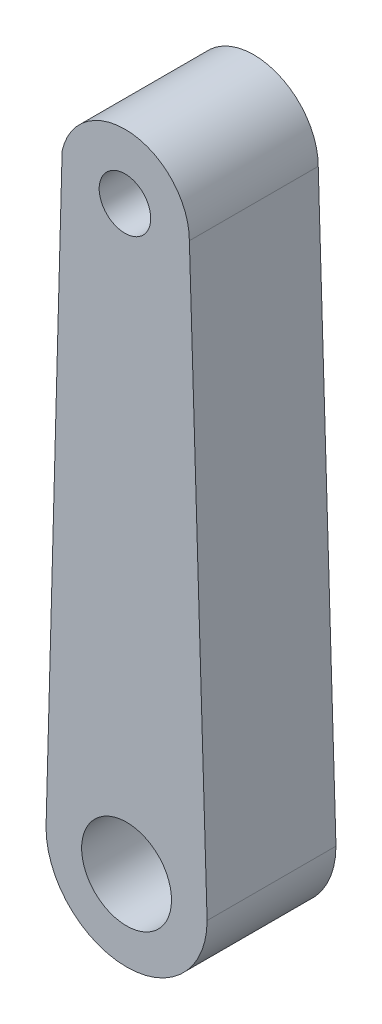
ISO-10303-21;
HEADER;
FILE_DESCRIPTION(('STEP AP214'),'2;1');
FILE_NAME('part.step','',(''),(''),'','','');
FILE_SCHEMA(('AUTOMOTIVE_DESIGN { 1 0 10303 214 1 1 1 1 }'));
ENDSEC;
DATA;
#1=APPLICATION_CONTEXT('core data for automotive mechanical design processes');
#2=APPLICATION_PROTOCOL_DEFINITION('international standard','automotive_design',2000,#1);
#3=PRODUCT_CONTEXT('',#1,'mechanical');
#4=PRODUCT('Part','Part','',(#3));
#5=PRODUCT_RELATED_PRODUCT_CATEGORY('part','',(#4));
#6=PRODUCT_DEFINITION_FORMATION('','',#4);
#7=PRODUCT_DEFINITION_CONTEXT('part definition',#1,'design');
#8=PRODUCT_DEFINITION('design','',#6,#7);
#9=PRODUCT_DEFINITION_SHAPE('','',#8);
#10=(LENGTH_UNIT() NAMED_UNIT(*) SI_UNIT(.MILLI.,.METRE.));
#11=(NAMED_UNIT(*) PLANE_ANGLE_UNIT() SI_UNIT($,.RADIAN.));
#12=(NAMED_UNIT(*) SI_UNIT($,.STERADIAN.) SOLID_ANGLE_UNIT());
#13=UNCERTAINTY_MEASURE_WITH_UNIT(LENGTH_MEASURE(1.E-05),#10,'distance_accuracy_value','');
#14=(GEOMETRIC_REPRESENTATION_CONTEXT(3) GLOBAL_UNCERTAINTY_ASSIGNED_CONTEXT((#13)) GLOBAL_UNIT_ASSIGNED_CONTEXT((#10,
#11,#12)) REPRESENTATION_CONTEXT('',''));
#15=CARTESIAN_POINT('',(0.,0.,0.));
#16=DIRECTION('',(0.,0.,1.));
#17=DIRECTION('',(1.,0.,0.));
#18=AXIS2_PLACEMENT_3D('',#15,#16,#17);
#19=CARTESIAN_POINT('',(0.,0.,10.));
#20=DIRECTION('',(0.,0.,-1.));
#21=DIRECTION('',(-1.,0.,0.));
#22=AXIS2_PLACEMENT_3D('',#19,#20,#21);
#23=CYLINDRICAL_SURFACE('',#22,12.5);
#24=CARTESIAN_POINT('',(0.,0.,-10.));
#25=DIRECTION('',(0.,0.,1.));
#26=DIRECTION('',(1.,0.,0.));
#27=AXIS2_PLACEMENT_3D('',#24,#25,#26);
#28=CIRCLE('',#27,12.5);
#29=CARTESIAN_POINT('',(-12.5,0.,-10.));
#30=VERTEX_POINT('',#29);
#31=CARTESIAN_POINT('',(12.5,0.,-10.));
#32=VERTEX_POINT('',#31);
#33=EDGE_CURVE('E102',#30,#32,#28,.T.);
#34=ORIENTED_EDGE('',*,*,#33,.T.);
#35=DIRECTION('',(0.,0.,-1.));
#36=VECTOR('',#35,1.);
#37=CARTESIAN_POINT('',(12.5,0.,10.));
#38=LINE('',#37,#36);
#39=CARTESIAN_POINT('',(12.5,0.,10.));
#40=VERTEX_POINT('',#39);
#41=EDGE_CURVE('E11',#40,#32,#38,.T.);
#42=ORIENTED_EDGE('',*,*,#41,.F.);
#43=CARTESIAN_POINT('',(0.,0.,10.));
#44=DIRECTION('',(0.,0.,1.));
#45=DIRECTION('',(1.,0.,0.));
#46=AXIS2_PLACEMENT_3D('',#43,#44,#45);
#47=CIRCLE('',#46,12.5);
#48=CARTESIAN_POINT('',(-12.5,0.,10.));
#49=VERTEX_POINT('',#48);
#50=EDGE_CURVE('E90',#49,#40,#47,.T.);
#51=ORIENTED_EDGE('',*,*,#50,.F.);
#52=DIRECTION('',(0.,0.,-1.));
#53=VECTOR('',#52,1.);
#54=CARTESIAN_POINT('',(-12.5,0.,10.));
#55=LINE('',#54,#53);
#56=EDGE_CURVE('E98',#49,#30,#55,.T.);
#57=ORIENTED_EDGE('',*,*,#56,.T.);
#58=EDGE_LOOP('',(#34,#42,#51,#57));
#59=FACE_BOUND('',#58,.T.);
#60=ADVANCED_FACE('F39',(#59),#23,.T.);
#61=CARTESIAN_POINT('',(12.5,0.,10.));
#62=DIRECTION('',(-0.99953263266437,-0.0305698583417314,0.));
#63=DIRECTION('',(0.0305698583417314,-0.99953263266437,0.));
#64=AXIS2_PLACEMENT_3D('',#61,#62,#63);
#65=PLANE('',#64);
#66=DIRECTION('',(-0.0305698583417314,0.99953263266437,0.));
#67=VECTOR('',#66,1.);
#68=CARTESIAN_POINT('',(12.5,0.,-10.));
#69=LINE('',#68,#67);
#70=CARTESIAN_POINT('',(9.74743712456775,89.9996456214909,-10.));
#71=VERTEX_POINT('',#70);
#72=EDGE_CURVE('E94',#32,#71,#69,.T.);
#73=ORIENTED_EDGE('',*,*,#72,.T.);
#74=DIRECTION('',(0.,0.,-1.));
#75=VECTOR('',#74,1.);
#76=CARTESIAN_POINT('',(9.74743712456775,89.9996456214909,10.));
#77=LINE('',#76,#75);
#78=CARTESIAN_POINT('',(9.74743712456775,89.9996456214909,10.));
#79=VERTEX_POINT('',#78);
#80=EDGE_CURVE('E47',#79,#71,#77,.T.);
#81=ORIENTED_EDGE('',*,*,#80,.F.);
#82=DIRECTION('',(-0.0305698583417314,0.99953263266437,0.));
#83=VECTOR('',#82,1.);
#84=CARTESIAN_POINT('',(12.5,0.,10.));
#85=LINE('',#84,#83);
#86=EDGE_CURVE('E85',#40,#79,#85,.T.);
#87=ORIENTED_EDGE('',*,*,#86,.F.);
#88=ORIENTED_EDGE('',*,*,#41,.T.);
#89=EDGE_LOOP('',(#73,#81,#87,#88));
#90=FACE_BOUND('',#89,.T.);
#91=ADVANCED_FACE('F93',(#90),#65,.F.);
#92=CARTESIAN_POINT('',(-0.252562875432245,89.9996456214909,10.));
#93=DIRECTION('',(0.,0.,-1.));
#94=DIRECTION('',(-1.,0.,0.));
#95=AXIS2_PLACEMENT_3D('',#92,#93,#94);
#96=CYLINDRICAL_SURFACE('',#95,10.);
#97=CARTESIAN_POINT('',(-0.252562875432245,89.9996456214909,-10.));
#98=DIRECTION('',(0.,0.,1.));
#99=DIRECTION('',(-1.,0.,0.));
#100=AXIS2_PLACEMENT_3D('',#97,#98,#99);
#101=CIRCLE('',#100,10.);
#102=CARTESIAN_POINT('',(-10.0000000000001,92.2329099369261,-10.));
#103=VERTEX_POINT('',#102);
#104=EDGE_CURVE('E72',#71,#103,#101,.T.);
#105=ORIENTED_EDGE('',*,*,#104,.T.);
#106=DIRECTION('',(0.,0.,-1.));
#107=VECTOR('',#106,1.);
#108=CARTESIAN_POINT('',(-10.0000000000001,92.2329099369261,10.));
#109=LINE('',#108,#107);
#110=CARTESIAN_POINT('',(-10.0000000000001,92.2329099369261,10.));
#111=VERTEX_POINT('',#110);
#112=EDGE_CURVE('E95',#111,#103,#109,.T.);
#113=ORIENTED_EDGE('',*,*,#112,.F.);
#114=CARTESIAN_POINT('',(-0.252562875432245,89.9996456214909,10.));
#115=DIRECTION('',(0.,0.,1.));
#116=DIRECTION('',(-1.,0.,0.));
#117=AXIS2_PLACEMENT_3D('',#114,#115,#116);
#118=CIRCLE('',#117,10.);
#119=EDGE_CURVE('E88',#79,#111,#118,.T.);
#120=ORIENTED_EDGE('',*,*,#119,.F.);
#121=ORIENTED_EDGE('',*,*,#80,.T.);
#122=EDGE_LOOP('',(#105,#113,#120,#121));
#123=FACE_BOUND('',#122,.T.);
#124=ADVANCED_FACE('F96',(#123),#96,.T.);
#125=CARTESIAN_POINT('',(-12.5,0.,10.));
#126=DIRECTION('',(0.999632853853288,-0.0270953408749884,0.));
#127=DIRECTION('',(0.0270953408749884,0.999632853853288,0.));
#128=AXIS2_PLACEMENT_3D('',#125,#126,#127);
#129=PLANE('',#128);
#130=DIRECTION('',(-0.0270953408749884,-0.999632853853288,0.));
#131=VECTOR('',#130,1.);
#132=CARTESIAN_POINT('',(-12.5,0.,-10.));
#133=LINE('',#132,#131);
#134=EDGE_CURVE('E78',#103,#30,#133,.T.);
#135=ORIENTED_EDGE('',*,*,#134,.T.);
#136=ORIENTED_EDGE('',*,*,#56,.F.);
#137=DIRECTION('',(-0.0270953408749884,-0.999632853853288,0.));
#138=VECTOR('',#137,1.);
#139=CARTESIAN_POINT('',(-12.5,0.,10.));
#140=LINE('',#139,#138);
#141=EDGE_CURVE('E55',#111,#49,#140,.T.);
#142=ORIENTED_EDGE('',*,*,#141,.F.);
#143=ORIENTED_EDGE('',*,*,#112,.T.);
#144=EDGE_LOOP('',(#135,#136,#142,#143));
#145=FACE_BOUND('',#144,.T.);
#146=ADVANCED_FACE('F110',(#145),#129,.F.);
#147=CARTESIAN_POINT('',(0.,0.,10.));
#148=DIRECTION('',(0.,0.,1.));
#149=DIRECTION('',(1.,0.,0.));
#150=AXIS2_PLACEMENT_3D('',#147,#148,#149);
#151=PLANE('',#150);
#152=CARTESIAN_POINT('',(0.,0.,10.));
#153=DIRECTION('',(0.,0.,1.));
#154=DIRECTION('',(1.,0.,0.));
#155=AXIS2_PLACEMENT_3D('',#152,#153,#154);
#156=CIRCLE('',#155,6.975);
#157=CARTESIAN_POINT('',(6.975,0.,10.));
#158=VERTEX_POINT('',#157);
#159=EDGE_CURVE('E122',#158,#158,#156,.T.);
#160=ORIENTED_EDGE('',*,*,#159,.F.);
#161=EDGE_LOOP('',(#160));
#162=FACE_BOUND('',#161,.T.);
#163=CARTESIAN_POINT('',(-0.252562875432245,89.9996456214909,10.));
#164=DIRECTION('',(0.,0.,1.));
#165=DIRECTION('',(1.,0.,0.));
#166=AXIS2_PLACEMENT_3D('',#163,#164,#165);
#167=CIRCLE('',#166,4.);
#168=CARTESIAN_POINT('',(3.74743712456776,89.9996456214909,10.));
#169=VERTEX_POINT('',#168);
#170=EDGE_CURVE('E116',#169,#169,#167,.T.);
#171=ORIENTED_EDGE('',*,*,#170,.F.);
#172=EDGE_LOOP('',(#171));
#173=FACE_BOUND('',#172,.T.);
#174=ORIENTED_EDGE('',*,*,#50,.T.);
#175=ORIENTED_EDGE('',*,*,#86,.T.);
#176=ORIENTED_EDGE('',*,*,#119,.T.);
#177=ORIENTED_EDGE('',*,*,#141,.T.);
#178=EDGE_LOOP('',(#174,#175,#176,#177));
#179=FACE_BOUND('',#178,.T.);
#180=ADVANCED_FACE('F86',(#162,#173,#179),#151,.T.);
#181=CARTESIAN_POINT('',(0.,0.,-10.));
#182=DIRECTION('',(0.,0.,1.));
#183=DIRECTION('',(1.,0.,0.));
#184=AXIS2_PLACEMENT_3D('',#181,#182,#183);
#185=PLANE('',#184);
#186=CARTESIAN_POINT('',(0.,0.,-10.));
#187=DIRECTION('',(0.,0.,1.));
#188=DIRECTION('',(1.,0.,0.));
#189=AXIS2_PLACEMENT_3D('',#186,#187,#188);
#190=CIRCLE('',#189,6.975);
#191=CARTESIAN_POINT('',(6.975,0.,-10.));
#192=VERTEX_POINT('',#191);
#193=EDGE_CURVE('E119',#192,#192,#190,.T.);
#194=ORIENTED_EDGE('',*,*,#193,.T.);
#195=EDGE_LOOP('',(#194));
#196=FACE_BOUND('',#195,.T.);
#197=CARTESIAN_POINT('',(-0.252562875432245,89.9996456214909,-10.));
#198=DIRECTION('',(0.,0.,1.));
#199=DIRECTION('',(1.,0.,0.));
#200=AXIS2_PLACEMENT_3D('',#197,#198,#199);
#201=CIRCLE('',#200,4.);
#202=CARTESIAN_POINT('',(3.74743712456776,89.9996456214909,-10.));
#203=VERTEX_POINT('',#202);
#204=EDGE_CURVE('E105',#203,#203,#201,.T.);
#205=ORIENTED_EDGE('',*,*,#204,.T.);
#206=EDGE_LOOP('',(#205));
#207=FACE_BOUND('',#206,.T.);
#208=ORIENTED_EDGE('',*,*,#33,.F.);
#209=ORIENTED_EDGE('',*,*,#134,.F.);
#210=ORIENTED_EDGE('',*,*,#104,.F.);
#211=ORIENTED_EDGE('',*,*,#72,.F.);
#212=EDGE_LOOP('',(#208,#209,#210,#211));
#213=FACE_BOUND('',#212,.T.);
#214=ADVANCED_FACE('F113',(#196,#207,#213),#185,.F.);
#215=CARTESIAN_POINT('',(-0.252562875432245,89.9996456214909,-10.));
#216=DIRECTION('',(0.,0.,1.));
#217=DIRECTION('',(1.,0.,0.));
#218=AXIS2_PLACEMENT_3D('',#215,#216,#217);
#219=CYLINDRICAL_SURFACE('',#218,4.);
#220=ORIENTED_EDGE('',*,*,#204,.F.);
#221=EDGE_LOOP('',(#220));
#222=FACE_BOUND('',#221,.T.);
#223=ORIENTED_EDGE('',*,*,#170,.T.);
#224=EDGE_LOOP('',(#223));
#225=FACE_BOUND('',#224,.T.);
#226=ADVANCED_FACE('F133',(#222,#225),#219,.F.);
#227=CARTESIAN_POINT('',(0.,0.,-10.));
#228=DIRECTION('',(0.,0.,1.));
#229=DIRECTION('',(1.,0.,0.));
#230=AXIS2_PLACEMENT_3D('',#227,#228,#229);
#231=CYLINDRICAL_SURFACE('',#230,6.975);
#232=ORIENTED_EDGE('',*,*,#193,.F.);
#233=EDGE_LOOP('',(#232));
#234=FACE_BOUND('',#233,.T.);
#235=ORIENTED_EDGE('',*,*,#159,.T.);
#236=EDGE_LOOP('',(#235));
#237=FACE_BOUND('',#236,.T.);
#238=ADVANCED_FACE('F130',(#234,#237),#231,.F.);
#239=CLOSED_SHELL('',(#60,#91,#124,#146,#180,#214,#226,#238));
#240=MANIFOLD_SOLID_BREP('B2',#239);
#241=ADVANCED_BREP_SHAPE_REPRESENTATION('',(#18,#240),#14);
#242=SHAPE_DEFINITION_REPRESENTATION(#9,#241);
ENDSEC;
END-ISO-10303-21;
